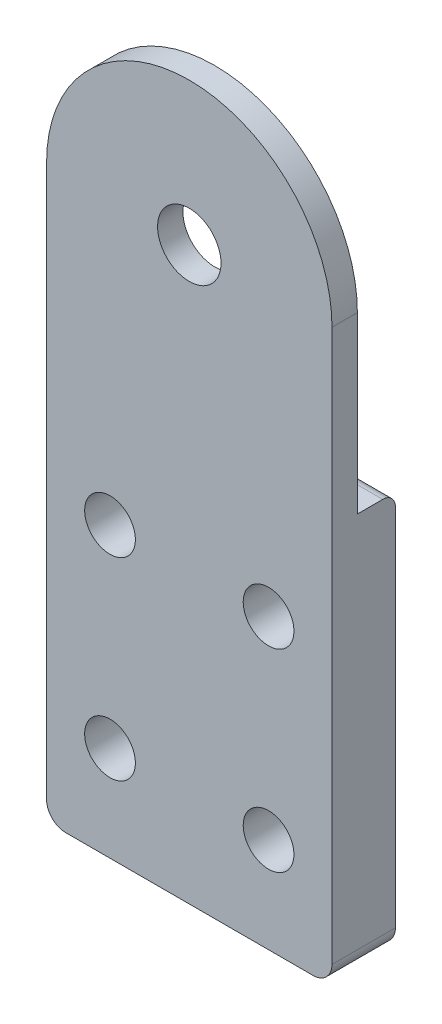
ISO-10303-21;
HEADER;
FILE_DESCRIPTION(('STEP AP214'),'2;1');
FILE_NAME('part.step','',(''),(''),'','','');
FILE_SCHEMA(('AUTOMOTIVE_DESIGN { 1 0 10303 214 1 1 1 1 }'));
ENDSEC;
DATA;
#1=APPLICATION_CONTEXT('core data for automotive mechanical design processes');
#2=APPLICATION_PROTOCOL_DEFINITION('international standard','automotive_design',2000,#1);
#3=PRODUCT_CONTEXT('',#1,'mechanical');
#4=PRODUCT('Part','Part','',(#3));
#5=PRODUCT_RELATED_PRODUCT_CATEGORY('part','',(#4));
#6=PRODUCT_DEFINITION_FORMATION('','',#4);
#7=PRODUCT_DEFINITION_CONTEXT('part definition',#1,'design');
#8=PRODUCT_DEFINITION('design','',#6,#7);
#9=PRODUCT_DEFINITION_SHAPE('','',#8);
#10=(LENGTH_UNIT() NAMED_UNIT(*) SI_UNIT(.MILLI.,.METRE.));
#11=(NAMED_UNIT(*) PLANE_ANGLE_UNIT() SI_UNIT($,.RADIAN.));
#12=(NAMED_UNIT(*) SI_UNIT($,.STERADIAN.) SOLID_ANGLE_UNIT());
#13=UNCERTAINTY_MEASURE_WITH_UNIT(LENGTH_MEASURE(1.E-05),#10,'distance_accuracy_value','');
#14=(GEOMETRIC_REPRESENTATION_CONTEXT(3) GLOBAL_UNCERTAINTY_ASSIGNED_CONTEXT((#13)) GLOBAL_UNIT_ASSIGNED_CONTEXT((#10,
#11,#12)) REPRESENTATION_CONTEXT('',''));
#15=CARTESIAN_POINT('',(0.,0.,0.));
#16=DIRECTION('',(0.,0.,1.));
#17=DIRECTION('',(1.,0.,0.));
#18=AXIS2_PLACEMENT_3D('',#15,#16,#17);
#19=CARTESIAN_POINT('',(0.,0.,10.));
#20=DIRECTION('',(0.,0.,-1.));
#21=DIRECTION('',(-1.,0.,0.));
#22=AXIS2_PLACEMENT_3D('',#19,#20,#21);
#23=CYLINDRICAL_SURFACE('',#22,22.5);
#24=CARTESIAN_POINT('',(0.,0.,6.));
#25=DIRECTION('',(0.,0.,-1.));
#26=DIRECTION('',(-1.,0.,0.));
#27=AXIS2_PLACEMENT_3D('',#24,#25,#26);
#28=CIRCLE('',#27,22.5);
#29=CARTESIAN_POINT('',(-22.5,0.,6.));
#30=VERTEX_POINT('',#29);
#31=CARTESIAN_POINT('',(22.5,0.,6.));
#32=VERTEX_POINT('',#31);
#33=EDGE_CURVE('E128',#30,#32,#28,.T.);
#34=ORIENTED_EDGE('',*,*,#33,.F.);
#35=DIRECTION('',(0.,0.,-1.));
#36=VECTOR('',#35,1.);
#37=CARTESIAN_POINT('',(-22.5,0.,10.));
#38=LINE('',#37,#36);
#39=CARTESIAN_POINT('',(-22.5,0.,10.));
#40=VERTEX_POINT('',#39);
#41=EDGE_CURVE('E154',#40,#30,#38,.T.);
#42=ORIENTED_EDGE('',*,*,#41,.F.);
#43=CARTESIAN_POINT('',(0.,0.,10.));
#44=DIRECTION('',(0.,0.,1.));
#45=DIRECTION('',(1.,0.,0.));
#46=AXIS2_PLACEMENT_3D('',#43,#44,#45);
#47=CIRCLE('',#46,22.5);
#48=CARTESIAN_POINT('',(22.5,0.,10.));
#49=VERTEX_POINT('',#48);
#50=EDGE_CURVE('E152',#49,#40,#47,.T.);
#51=ORIENTED_EDGE('',*,*,#50,.F.);
#52=DIRECTION('',(0.,0.,-1.));
#53=VECTOR('',#52,1.);
#54=CARTESIAN_POINT('',(22.5,0.,10.));
#55=LINE('',#54,#53);
#56=EDGE_CURVE('E165',#49,#32,#55,.T.);
#57=ORIENTED_EDGE('',*,*,#56,.T.);
#58=EDGE_LOOP('',(#34,#42,#51,#57));
#59=FACE_BOUND('',#58,.T.);
#60=ADVANCED_FACE('F41',(#59),#23,.T.);
#61=CARTESIAN_POINT('',(-22.5,0.,10.));
#62=DIRECTION('',(1.,0.,0.));
#63=DIRECTION('',(0.,1.,0.));
#64=AXIS2_PLACEMENT_3D('',#61,#62,#63);
#65=PLANE('',#64);
#66=DIRECTION('',(0.,0.,-1.));
#67=VECTOR('',#66,1.);
#68=CARTESIAN_POINT('',(-22.5,-27.5,6.));
#69=LINE('',#68,#67);
#70=CARTESIAN_POINT('',(-22.5,-27.5,6.));
#71=VERTEX_POINT('',#70);
#72=CARTESIAN_POINT('',(-22.5,-27.5,2.));
#73=VERTEX_POINT('',#72);
#74=EDGE_CURVE('E119',#71,#73,#69,.T.);
#75=ORIENTED_EDGE('',*,*,#74,.T.);
#76=CARTESIAN_POINT('',(-22.5,-29.5,2.));
#77=DIRECTION('',(1.,0.,0.));
#78=DIRECTION('',(0.,1.,0.));
#79=AXIS2_PLACEMENT_3D('',#76,#77,#78);
#80=CIRCLE('',#79,2.);
#81=CARTESIAN_POINT('',(-22.5,-29.5,0.));
#82=VERTEX_POINT('',#81);
#83=EDGE_CURVE('E64',#73,#82,#80,.F.);
#84=ORIENTED_EDGE('',*,*,#83,.T.);
#85=DIRECTION('',(0.,-1.,0.));
#86=VECTOR('',#85,1.);
#87=CARTESIAN_POINT('',(-22.5,0.,0.));
#88=LINE('',#87,#86);
#89=CARTESIAN_POINT('',(-22.5,-87.,0.));
#90=VERTEX_POINT('',#89);
#91=EDGE_CURVE('E136',#82,#90,#88,.T.);
#92=ORIENTED_EDGE('',*,*,#91,.T.);
#93=DIRECTION('',(0.,0.,-1.));
#94=VECTOR('',#93,1.);
#95=CARTESIAN_POINT('',(-22.5,-87.,10.));
#96=LINE('',#95,#94);
#97=CARTESIAN_POINT('',(-22.5,-87.,10.));
#98=VERTEX_POINT('',#97);
#99=EDGE_CURVE('E176',#98,#90,#96,.T.);
#100=ORIENTED_EDGE('',*,*,#99,.F.);
#101=DIRECTION('',(0.,-1.,0.));
#102=VECTOR('',#101,1.);
#103=CARTESIAN_POINT('',(-22.5,0.,10.));
#104=LINE('',#103,#102);
#105=EDGE_CURVE('E140',#40,#98,#104,.T.);
#106=ORIENTED_EDGE('',*,*,#105,.F.);
#107=ORIENTED_EDGE('',*,*,#41,.T.);
#108=DIRECTION('',(0.,1.,0.));
#109=VECTOR('',#108,1.);
#110=CARTESIAN_POINT('',(-22.5,0.,6.));
#111=LINE('',#110,#109);
#112=EDGE_CURVE('E122',#71,#30,#111,.T.);
#113=ORIENTED_EDGE('',*,*,#112,.F.);
#114=EDGE_LOOP('',(#75,#84,#92,#100,#106,#107,#113));
#115=FACE_BOUND('',#114,.T.);
#116=ADVANCED_FACE('F183',(#115),#65,.F.);
#117=CARTESIAN_POINT('',(-19.5,-87.,10.));
#118=DIRECTION('',(0.,0.,-1.));
#119=DIRECTION('',(-1.,0.,0.));
#120=AXIS2_PLACEMENT_3D('',#117,#118,#119);
#121=CYLINDRICAL_SURFACE('',#120,3.);
#122=CARTESIAN_POINT('',(-19.5,-87.,0.));
#123=DIRECTION('',(0.,0.,1.));
#124=DIRECTION('',(1.,0.,0.));
#125=AXIS2_PLACEMENT_3D('',#122,#123,#124);
#126=CIRCLE('',#125,3.);
#127=CARTESIAN_POINT('',(-19.5,-90.,0.));
#128=VERTEX_POINT('',#127);
#129=EDGE_CURVE('E156',#90,#128,#126,.T.);
#130=ORIENTED_EDGE('',*,*,#129,.T.);
#131=DIRECTION('',(0.,0.,-1.));
#132=VECTOR('',#131,1.);
#133=CARTESIAN_POINT('',(-19.5,-90.,10.));
#134=LINE('',#133,#132);
#135=CARTESIAN_POINT('',(-19.5,-90.,10.));
#136=VERTEX_POINT('',#135);
#137=EDGE_CURVE('E173',#136,#128,#134,.T.);
#138=ORIENTED_EDGE('',*,*,#137,.F.);
#139=CARTESIAN_POINT('',(-19.5,-87.,10.));
#140=DIRECTION('',(0.,0.,1.));
#141=DIRECTION('',(1.,0.,0.));
#142=AXIS2_PLACEMENT_3D('',#139,#140,#141);
#143=CIRCLE('',#142,3.);
#144=EDGE_CURVE('E143',#98,#136,#143,.T.);
#145=ORIENTED_EDGE('',*,*,#144,.F.);
#146=ORIENTED_EDGE('',*,*,#99,.T.);
#147=EDGE_LOOP('',(#130,#138,#145,#146));
#148=FACE_BOUND('',#147,.T.);
#149=ADVANCED_FACE('F252',(#148),#121,.T.);
#150=CARTESIAN_POINT('',(0.,-90.,10.));
#151=DIRECTION('',(0.,1.,0.));
#152=DIRECTION('',(0.,0.,1.));
#153=AXIS2_PLACEMENT_3D('',#150,#151,#152);
#154=PLANE('',#153);
#155=DIRECTION('',(1.,0.,0.));
#156=VECTOR('',#155,1.);
#157=CARTESIAN_POINT('',(0.,-90.,0.));
#158=LINE('',#157,#156);
#159=CARTESIAN_POINT('',(19.5,-90.,0.));
#160=VERTEX_POINT('',#159);
#161=EDGE_CURVE('E158',#128,#160,#158,.T.);
#162=ORIENTED_EDGE('',*,*,#161,.T.);
#163=DIRECTION('',(0.,0.,-1.));
#164=VECTOR('',#163,1.);
#165=CARTESIAN_POINT('',(19.5,-90.,10.));
#166=LINE('',#165,#164);
#167=CARTESIAN_POINT('',(19.5,-90.,10.));
#168=VERTEX_POINT('',#167);
#169=EDGE_CURVE('E170',#168,#160,#166,.T.);
#170=ORIENTED_EDGE('',*,*,#169,.F.);
#171=DIRECTION('',(1.,0.,0.));
#172=VECTOR('',#171,1.);
#173=CARTESIAN_POINT('',(0.,-90.,10.));
#174=LINE('',#173,#172);
#175=EDGE_CURVE('E146',#136,#168,#174,.T.);
#176=ORIENTED_EDGE('',*,*,#175,.F.);
#177=ORIENTED_EDGE('',*,*,#137,.T.);
#178=EDGE_LOOP('',(#162,#170,#176,#177));
#179=FACE_BOUND('',#178,.T.);
#180=ADVANCED_FACE('F260',(#179),#154,.F.);
#181=CARTESIAN_POINT('',(19.5,-87.,10.));
#182=DIRECTION('',(0.,0.,-1.));
#183=DIRECTION('',(-1.,0.,0.));
#184=AXIS2_PLACEMENT_3D('',#181,#182,#183);
#185=CYLINDRICAL_SURFACE('',#184,3.);
#186=CARTESIAN_POINT('',(19.5,-87.,0.));
#187=DIRECTION('',(0.,0.,1.));
#188=DIRECTION('',(1.,0.,0.));
#189=AXIS2_PLACEMENT_3D('',#186,#187,#188);
#190=CIRCLE('',#189,3.);
#191=CARTESIAN_POINT('',(22.5,-87.,0.));
#192=VERTEX_POINT('',#191);
#193=EDGE_CURVE('E160',#160,#192,#190,.T.);
#194=ORIENTED_EDGE('',*,*,#193,.T.);
#195=DIRECTION('',(0.,0.,-1.));
#196=VECTOR('',#195,1.);
#197=CARTESIAN_POINT('',(22.5,-87.,10.));
#198=LINE('',#197,#196);
#199=CARTESIAN_POINT('',(22.5,-87.,10.));
#200=VERTEX_POINT('',#199);
#201=EDGE_CURVE('E167',#200,#192,#198,.T.);
#202=ORIENTED_EDGE('',*,*,#201,.F.);
#203=CARTESIAN_POINT('',(19.5,-87.,10.));
#204=DIRECTION('',(0.,0.,1.));
#205=DIRECTION('',(1.,0.,0.));
#206=AXIS2_PLACEMENT_3D('',#203,#204,#205);
#207=CIRCLE('',#206,3.);
#208=EDGE_CURVE('E148',#168,#200,#207,.T.);
#209=ORIENTED_EDGE('',*,*,#208,.F.);
#210=ORIENTED_EDGE('',*,*,#169,.T.);
#211=EDGE_LOOP('',(#194,#202,#209,#210));
#212=FACE_BOUND('',#211,.T.);
#213=ADVANCED_FACE('F257',(#212),#185,.T.);
#214=CARTESIAN_POINT('',(22.5,0.,10.));
#215=DIRECTION('',(-1.,0.,0.));
#216=DIRECTION('',(0.,-1.,0.));
#217=AXIS2_PLACEMENT_3D('',#214,#215,#216);
#218=PLANE('',#217);
#219=DIRECTION('',(0.,1.,0.));
#220=VECTOR('',#219,1.);
#221=CARTESIAN_POINT('',(22.5,0.,0.));
#222=LINE('',#221,#220);
#223=CARTESIAN_POINT('',(22.5,-29.5,0.));
#224=VERTEX_POINT('',#223);
#225=EDGE_CURVE('E144',#192,#224,#222,.T.);
#226=ORIENTED_EDGE('',*,*,#225,.T.);
#227=CARTESIAN_POINT('',(22.5,-29.5,2.));
#228=DIRECTION('',(-1.,0.,0.));
#229=DIRECTION('',(0.,-1.,0.));
#230=AXIS2_PLACEMENT_3D('',#227,#228,#229);
#231=CIRCLE('',#230,2.);
#232=CARTESIAN_POINT('',(22.5,-27.5,2.));
#233=VERTEX_POINT('',#232);
#234=EDGE_CURVE('E11',#224,#233,#231,.F.);
#235=ORIENTED_EDGE('',*,*,#234,.T.);
#236=DIRECTION('',(0.,0.,-1.));
#237=VECTOR('',#236,1.);
#238=CARTESIAN_POINT('',(22.5,-27.5,6.));
#239=LINE('',#238,#237);
#240=CARTESIAN_POINT('',(22.5,-27.5,6.));
#241=VERTEX_POINT('',#240);
#242=EDGE_CURVE('E117',#241,#233,#239,.T.);
#243=ORIENTED_EDGE('',*,*,#242,.F.);
#244=DIRECTION('',(0.,-1.,0.));
#245=VECTOR('',#244,1.);
#246=CARTESIAN_POINT('',(22.5,0.,6.));
#247=LINE('',#246,#245);
#248=EDGE_CURVE('E123',#32,#241,#247,.T.);
#249=ORIENTED_EDGE('',*,*,#248,.F.);
#250=ORIENTED_EDGE('',*,*,#56,.F.);
#251=DIRECTION('',(0.,1.,0.));
#252=VECTOR('',#251,1.);
#253=CARTESIAN_POINT('',(22.5,0.,10.));
#254=LINE('',#253,#252);
#255=EDGE_CURVE('E150',#200,#49,#254,.T.);
#256=ORIENTED_EDGE('',*,*,#255,.F.);
#257=ORIENTED_EDGE('',*,*,#201,.T.);
#258=EDGE_LOOP('',(#226,#235,#243,#249,#250,#256,#257));
#259=FACE_BOUND('',#258,.T.);
#260=ADVANCED_FACE('F133',(#259),#218,.F.);
#261=CARTESIAN_POINT('',(0.,0.,10.));
#262=DIRECTION('',(0.,0.,1.));
#263=DIRECTION('',(1.,0.,0.));
#264=AXIS2_PLACEMENT_3D('',#261,#262,#263);
#265=PLANE('',#264);
#266=CARTESIAN_POINT('',(12.5,-75.,10.));
#267=DIRECTION('',(0.,0.,-1.));
#268=DIRECTION('',(-1.,0.,0.));
#269=AXIS2_PLACEMENT_3D('',#266,#267,#268);
#270=CIRCLE('',#269,4.);
#271=CARTESIAN_POINT('',(8.49999999999999,-75.,10.));
#272=VERTEX_POINT('',#271);
#273=EDGE_CURVE('E201',#272,#272,#270,.T.);
#274=ORIENTED_EDGE('',*,*,#273,.T.);
#275=EDGE_LOOP('',(#274));
#276=FACE_BOUND('',#275,.T.);
#277=CARTESIAN_POINT('',(-12.5,-75.,10.));
#278=DIRECTION('',(0.,0.,-1.));
#279=DIRECTION('',(-1.,0.,0.));
#280=AXIS2_PLACEMENT_3D('',#277,#278,#279);
#281=CIRCLE('',#280,4.);
#282=CARTESIAN_POINT('',(-16.5,-75.,10.));
#283=VERTEX_POINT('',#282);
#284=EDGE_CURVE('E207',#283,#283,#281,.T.);
#285=ORIENTED_EDGE('',*,*,#284,.T.);
#286=EDGE_LOOP('',(#285));
#287=FACE_BOUND('',#286,.T.);
#288=CARTESIAN_POINT('',(-12.5,-44.5,10.));
#289=DIRECTION('',(0.,0.,-1.));
#290=DIRECTION('',(-1.,0.,0.));
#291=AXIS2_PLACEMENT_3D('',#288,#289,#290);
#292=CIRCLE('',#291,4.);
#293=CARTESIAN_POINT('',(-16.5,-44.5,10.));
#294=VERTEX_POINT('',#293);
#295=EDGE_CURVE('E195',#294,#294,#292,.T.);
#296=ORIENTED_EDGE('',*,*,#295,.T.);
#297=EDGE_LOOP('',(#296));
#298=FACE_BOUND('',#297,.T.);
#299=CARTESIAN_POINT('',(12.5,-44.5,10.));
#300=DIRECTION('',(0.,0.,-1.));
#301=DIRECTION('',(-1.,0.,0.));
#302=AXIS2_PLACEMENT_3D('',#299,#300,#301);
#303=CIRCLE('',#302,4.);
#304=CARTESIAN_POINT('',(8.49999999999999,-44.5,10.));
#305=VERTEX_POINT('',#304);
#306=EDGE_CURVE('E191',#305,#305,#303,.T.);
#307=ORIENTED_EDGE('',*,*,#306,.T.);
#308=EDGE_LOOP('',(#307));
#309=FACE_BOUND('',#308,.T.);
#310=CARTESIAN_POINT('',(0.,0.,10.));
#311=DIRECTION('',(0.,0.,1.));
#312=DIRECTION('',(1.,0.,0.));
#313=AXIS2_PLACEMENT_3D('',#310,#311,#312);
#314=CIRCLE('',#313,5.);
#315=CARTESIAN_POINT('',(5.,0.,10.));
#316=VERTEX_POINT('',#315);
#317=EDGE_CURVE('E188',#316,#316,#314,.T.);
#318=ORIENTED_EDGE('',*,*,#317,.F.);
#319=EDGE_LOOP('',(#318));
#320=FACE_BOUND('',#319,.T.);
#321=ORIENTED_EDGE('',*,*,#105,.T.);
#322=ORIENTED_EDGE('',*,*,#144,.T.);
#323=ORIENTED_EDGE('',*,*,#175,.T.);
#324=ORIENTED_EDGE('',*,*,#208,.T.);
#325=ORIENTED_EDGE('',*,*,#255,.T.);
#326=ORIENTED_EDGE('',*,*,#50,.T.);
#327=EDGE_LOOP('',(#321,#322,#323,#324,#325,#326));
#328=FACE_BOUND('',#327,.T.);
#329=ADVANCED_FACE('F216',(#276,#287,#298,#309,#320,#328),#265,.T.);
#330=CARTESIAN_POINT('',(0.,0.,0.));
#331=DIRECTION('',(0.,0.,1.));
#332=DIRECTION('',(1.,0.,0.));
#333=AXIS2_PLACEMENT_3D('',#330,#331,#332);
#334=PLANE('',#333);
#335=CARTESIAN_POINT('',(12.5,-75.,0.));
#336=DIRECTION('',(0.,0.,-1.));
#337=DIRECTION('',(-1.,0.,0.));
#338=AXIS2_PLACEMENT_3D('',#335,#336,#337);
#339=CIRCLE('',#338,4.);
#340=CARTESIAN_POINT('',(8.49999999999999,-75.,0.));
#341=VERTEX_POINT('',#340);
#342=EDGE_CURVE('E198',#341,#341,#339,.T.);
#343=ORIENTED_EDGE('',*,*,#342,.F.);
#344=EDGE_LOOP('',(#343));
#345=FACE_BOUND('',#344,.T.);
#346=CARTESIAN_POINT('',(-12.5,-75.,0.));
#347=DIRECTION('',(0.,0.,-1.));
#348=DIRECTION('',(-1.,0.,0.));
#349=AXIS2_PLACEMENT_3D('',#346,#347,#348);
#350=CIRCLE('',#349,4.);
#351=CARTESIAN_POINT('',(-16.5,-75.,0.));
#352=VERTEX_POINT('',#351);
#353=EDGE_CURVE('E204',#352,#352,#350,.T.);
#354=ORIENTED_EDGE('',*,*,#353,.F.);
#355=EDGE_LOOP('',(#354));
#356=FACE_BOUND('',#355,.T.);
#357=CARTESIAN_POINT('',(-12.5,-44.5,0.));
#358=DIRECTION('',(0.,0.,-1.));
#359=DIRECTION('',(-1.,0.,0.));
#360=AXIS2_PLACEMENT_3D('',#357,#358,#359);
#361=CIRCLE('',#360,4.);
#362=CARTESIAN_POINT('',(-16.5,-44.5,0.));
#363=VERTEX_POINT('',#362);
#364=EDGE_CURVE('E210',#363,#363,#361,.T.);
#365=ORIENTED_EDGE('',*,*,#364,.F.);
#366=EDGE_LOOP('',(#365));
#367=FACE_BOUND('',#366,.T.);
#368=CARTESIAN_POINT('',(12.5,-44.5,0.));
#369=DIRECTION('',(0.,0.,-1.));
#370=DIRECTION('',(-1.,0.,0.));
#371=AXIS2_PLACEMENT_3D('',#368,#369,#370);
#372=CIRCLE('',#371,4.);
#373=CARTESIAN_POINT('',(8.49999999999999,-44.5,0.));
#374=VERTEX_POINT('',#373);
#375=EDGE_CURVE('E192',#374,#374,#372,.T.);
#376=ORIENTED_EDGE('',*,*,#375,.F.);
#377=EDGE_LOOP('',(#376));
#378=FACE_BOUND('',#377,.T.);
#379=ORIENTED_EDGE('',*,*,#91,.F.);
#380=DIRECTION('',(-1.,0.,0.));
#381=VECTOR('',#380,1.);
#382=CARTESIAN_POINT('',(0.,-29.5,0.));
#383=LINE('',#382,#381);
#384=EDGE_CURVE('E50',#82,#224,#383,.F.);
#385=ORIENTED_EDGE('',*,*,#384,.T.);
#386=ORIENTED_EDGE('',*,*,#225,.F.);
#387=ORIENTED_EDGE('',*,*,#193,.F.);
#388=ORIENTED_EDGE('',*,*,#161,.F.);
#389=ORIENTED_EDGE('',*,*,#129,.F.);
#390=EDGE_LOOP('',(#379,#385,#386,#387,#388,#389));
#391=FACE_BOUND('',#390,.T.);
#392=ADVANCED_FACE('F227',(#345,#356,#367,#378,#391),#334,.F.);
#393=CARTESIAN_POINT('',(0.,-27.5,6.));
#394=DIRECTION('',(0.,-1.,0.));
#395=DIRECTION('',(0.,0.,-1.));
#396=AXIS2_PLACEMENT_3D('',#393,#394,#395);
#397=PLANE('',#396);
#398=ORIENTED_EDGE('',*,*,#242,.T.);
#399=DIRECTION('',(-1.,0.,0.));
#400=VECTOR('',#399,1.);
#401=CARTESIAN_POINT('',(0.,-27.5,2.));
#402=LINE('',#401,#400);
#403=EDGE_CURVE('E179',#233,#73,#402,.T.);
#404=ORIENTED_EDGE('',*,*,#403,.T.);
#405=ORIENTED_EDGE('',*,*,#74,.F.);
#406=DIRECTION('',(-1.,0.,0.));
#407=VECTOR('',#406,1.);
#408=CARTESIAN_POINT('',(0.,-27.5,6.));
#409=LINE('',#408,#407);
#410=EDGE_CURVE('E112',#241,#71,#409,.T.);
#411=ORIENTED_EDGE('',*,*,#410,.F.);
#412=EDGE_LOOP('',(#398,#404,#405,#411));
#413=FACE_BOUND('',#412,.T.);
#414=ADVANCED_FACE('F114',(#413),#397,.F.);
#415=CARTESIAN_POINT('',(0.,0.,6.));
#416=DIRECTION('',(0.,0.,-1.));
#417=DIRECTION('',(-1.,0.,0.));
#418=AXIS2_PLACEMENT_3D('',#415,#416,#417);
#419=PLANE('',#418);
#420=CARTESIAN_POINT('',(0.,0.,6.));
#421=DIRECTION('',(0.,0.,-1.));
#422=DIRECTION('',(-1.,0.,0.));
#423=AXIS2_PLACEMENT_3D('',#420,#421,#422);
#424=CIRCLE('',#423,5.);
#425=CARTESIAN_POINT('',(-5.,0.,6.));
#426=VERTEX_POINT('',#425);
#427=EDGE_CURVE('E45',#426,#426,#424,.T.);
#428=ORIENTED_EDGE('',*,*,#427,.F.);
#429=EDGE_LOOP('',(#428));
#430=FACE_BOUND('',#429,.T.);
#431=ORIENTED_EDGE('',*,*,#248,.T.);
#432=ORIENTED_EDGE('',*,*,#410,.T.);
#433=ORIENTED_EDGE('',*,*,#112,.T.);
#434=ORIENTED_EDGE('',*,*,#33,.T.);
#435=EDGE_LOOP('',(#431,#432,#433,#434));
#436=FACE_BOUND('',#435,.T.);
#437=ADVANCED_FACE('F126',(#430,#436),#419,.T.);
#438=CARTESIAN_POINT('',(0.,-29.5,2.));
#439=DIRECTION('',(-1.,0.,0.));
#440=DIRECTION('',(0.,0.,1.));
#441=AXIS2_PLACEMENT_3D('',#438,#439,#440);
#442=CYLINDRICAL_SURFACE('',#441,2.);
#443=ORIENTED_EDGE('',*,*,#234,.F.);
#444=ORIENTED_EDGE('',*,*,#384,.F.);
#445=ORIENTED_EDGE('',*,*,#83,.F.);
#446=ORIENTED_EDGE('',*,*,#403,.F.);
#447=EDGE_LOOP('',(#443,#444,#445,#446));
#448=FACE_BOUND('',#447,.T.);
#449=ADVANCED_FACE('F43',(#448),#442,.T.);
#450=CARTESIAN_POINT('',(0.,0.,4.));
#451=DIRECTION('',(0.,0.,1.));
#452=DIRECTION('',(1.,0.,0.));
#453=AXIS2_PLACEMENT_3D('',#450,#451,#452);
#454=CYLINDRICAL_SURFACE('',#453,5.);
#455=ORIENTED_EDGE('',*,*,#427,.T.);
#456=EDGE_LOOP('',(#455));
#457=FACE_BOUND('',#456,.T.);
#458=ORIENTED_EDGE('',*,*,#317,.T.);
#459=EDGE_LOOP('',(#458));
#460=FACE_BOUND('',#459,.T.);
#461=ADVANCED_FACE('F237',(#457,#460),#454,.F.);
#462=CARTESIAN_POINT('',(12.5,-44.5,10.));
#463=DIRECTION('',(0.,0.,-1.));
#464=DIRECTION('',(-1.,0.,0.));
#465=AXIS2_PLACEMENT_3D('',#462,#463,#464);
#466=CYLINDRICAL_SURFACE('',#465,4.);
#467=ORIENTED_EDGE('',*,*,#306,.F.);
#468=EDGE_LOOP('',(#467));
#469=FACE_BOUND('',#468,.T.);
#470=ORIENTED_EDGE('',*,*,#375,.T.);
#471=EDGE_LOOP('',(#470));
#472=FACE_BOUND('',#471,.T.);
#473=ADVANCED_FACE('F223',(#469,#472),#466,.F.);
#474=CARTESIAN_POINT('',(-12.5,-44.5,10.));
#475=DIRECTION('',(0.,0.,-1.));
#476=DIRECTION('',(-1.,0.,0.));
#477=AXIS2_PLACEMENT_3D('',#474,#475,#476);
#478=CYLINDRICAL_SURFACE('',#477,4.);
#479=ORIENTED_EDGE('',*,*,#295,.F.);
#480=EDGE_LOOP('',(#479));
#481=FACE_BOUND('',#480,.T.);
#482=ORIENTED_EDGE('',*,*,#364,.T.);
#483=EDGE_LOOP('',(#482));
#484=FACE_BOUND('',#483,.T.);
#485=ADVANCED_FACE('F219',(#481,#484),#478,.F.);
#486=CARTESIAN_POINT('',(-12.5,-75.,10.));
#487=DIRECTION('',(0.,0.,-1.));
#488=DIRECTION('',(-1.,0.,0.));
#489=AXIS2_PLACEMENT_3D('',#486,#487,#488);
#490=CYLINDRICAL_SURFACE('',#489,4.);
#491=ORIENTED_EDGE('',*,*,#284,.F.);
#492=EDGE_LOOP('',(#491));
#493=FACE_BOUND('',#492,.T.);
#494=ORIENTED_EDGE('',*,*,#353,.T.);
#495=EDGE_LOOP('',(#494));
#496=FACE_BOUND('',#495,.T.);
#497=ADVANCED_FACE('F222',(#493,#496),#490,.F.);
#498=CARTESIAN_POINT('',(12.5,-75.,10.));
#499=DIRECTION('',(0.,0.,-1.));
#500=DIRECTION('',(-1.,0.,0.));
#501=AXIS2_PLACEMENT_3D('',#498,#499,#500);
#502=CYLINDRICAL_SURFACE('',#501,4.);
#503=ORIENTED_EDGE('',*,*,#273,.F.);
#504=EDGE_LOOP('',(#503));
#505=FACE_BOUND('',#504,.T.);
#506=ORIENTED_EDGE('',*,*,#342,.T.);
#507=EDGE_LOOP('',(#506));
#508=FACE_BOUND('',#507,.T.);
#509=ADVANCED_FACE('F289',(#505,#508),#502,.F.);
#510=CLOSED_SHELL('',(#60,#116,#149,#180,#213,#260,#329,#392,#414,#437,#449,#461,#473,#485,#497,#509));
#511=MANIFOLD_SOLID_BREP('B2',#510);
#512=ADVANCED_BREP_SHAPE_REPRESENTATION('',(#18,#511),#14);
#513=SHAPE_DEFINITION_REPRESENTATION(#9,#512);
ENDSEC;
END-ISO-10303-21;
